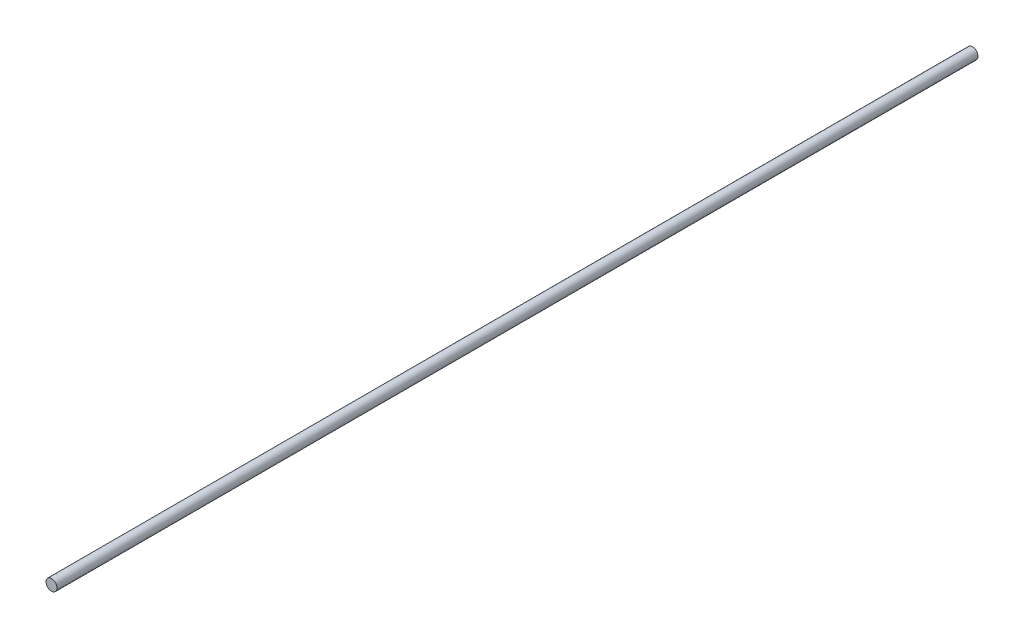
ISO-10303-21;
HEADER;
FILE_DESCRIPTION(('STEP AP214'),'2;1');
FILE_NAME('part.step','',(''),(''),'','','');
FILE_SCHEMA(('AUTOMOTIVE_DESIGN { 1 0 10303 214 1 1 1 1 }'));
ENDSEC;
DATA;
#1=APPLICATION_CONTEXT('core data for automotive mechanical design processes');
#2=APPLICATION_PROTOCOL_DEFINITION('international standard','automotive_design',2000,#1);
#3=PRODUCT_CONTEXT('',#1,'mechanical');
#4=PRODUCT('Part','Part','',(#3));
#5=PRODUCT_RELATED_PRODUCT_CATEGORY('part','',(#4));
#6=PRODUCT_DEFINITION_FORMATION('','',#4);
#7=PRODUCT_DEFINITION_CONTEXT('part definition',#1,'design');
#8=PRODUCT_DEFINITION('design','',#6,#7);
#9=PRODUCT_DEFINITION_SHAPE('','',#8);
#10=(LENGTH_UNIT() NAMED_UNIT(*) SI_UNIT(.MILLI.,.METRE.));
#11=(NAMED_UNIT(*) PLANE_ANGLE_UNIT() SI_UNIT($,.RADIAN.));
#12=(NAMED_UNIT(*) SI_UNIT($,.STERADIAN.) SOLID_ANGLE_UNIT());
#13=UNCERTAINTY_MEASURE_WITH_UNIT(LENGTH_MEASURE(1.E-05),#10,'distance_accuracy_value','');
#14=(GEOMETRIC_REPRESENTATION_CONTEXT(3) GLOBAL_UNCERTAINTY_ASSIGNED_CONTEXT((#13)) GLOBAL_UNIT_ASSIGNED_CONTEXT((#10,
#11,#12)) REPRESENTATION_CONTEXT('',''));
#15=CARTESIAN_POINT('',(0.,0.,0.));
#16=DIRECTION('',(0.,0.,1.));
#17=DIRECTION('',(1.,0.,0.));
#18=AXIS2_PLACEMENT_3D('',#15,#16,#17);
#19=CARTESIAN_POINT('',(0.,0.,200.));
#20=DIRECTION('',(0.,0.,-1.));
#21=DIRECTION('',(-1.,0.,0.));
#22=AXIS2_PLACEMENT_3D('',#19,#20,#21);
#23=CYLINDRICAL_SURFACE('',#22,1.2);
#24=CARTESIAN_POINT('',(0.,0.,200.));
#25=DIRECTION('',(0.,0.,1.));
#26=DIRECTION('',(1.,0.,0.));
#27=AXIS2_PLACEMENT_3D('',#24,#25,#26);
#28=CIRCLE('',#27,1.2);
#29=CARTESIAN_POINT('',(1.2,0.,200.));
#30=VERTEX_POINT('',#29);
#31=EDGE_CURVE('E10',#30,#30,#28,.T.);
#32=ORIENTED_EDGE('',*,*,#31,.F.);
#33=EDGE_LOOP('',(#32));
#34=FACE_BOUND('',#33,.T.);
#35=CARTESIAN_POINT('',(0.,0.,0.));
#36=DIRECTION('',(0.,0.,1.));
#37=DIRECTION('',(1.,0.,0.));
#38=AXIS2_PLACEMENT_3D('',#35,#36,#37);
#39=CIRCLE('',#38,1.2);
#40=CARTESIAN_POINT('',(1.2,0.,0.));
#41=VERTEX_POINT('',#40);
#42=EDGE_CURVE('E34',#41,#41,#39,.T.);
#43=ORIENTED_EDGE('',*,*,#42,.T.);
#44=EDGE_LOOP('',(#43));
#45=FACE_BOUND('',#44,.T.);
#46=ADVANCED_FACE('F31',(#34,#45),#23,.T.);
#47=CARTESIAN_POINT('',(0.,0.,200.));
#48=DIRECTION('',(0.,0.,1.));
#49=DIRECTION('',(1.,0.,0.));
#50=AXIS2_PLACEMENT_3D('',#47,#48,#49);
#51=PLANE('',#50);
#52=ORIENTED_EDGE('',*,*,#31,.T.);
#53=EDGE_LOOP('',(#52));
#54=FACE_BOUND('',#53,.T.);
#55=ADVANCED_FACE('F46',(#54),#51,.T.);
#56=CARTESIAN_POINT('',(0.,0.,0.));
#57=DIRECTION('',(0.,0.,1.));
#58=DIRECTION('',(1.,0.,0.));
#59=AXIS2_PLACEMENT_3D('',#56,#57,#58);
#60=PLANE('',#59);
#61=ORIENTED_EDGE('',*,*,#42,.F.);
#62=EDGE_LOOP('',(#61));
#63=FACE_BOUND('',#62,.T.);
#64=ADVANCED_FACE('F44',(#63),#60,.F.);
#65=CLOSED_SHELL('',(#46,#55,#64));
#66=MANIFOLD_SOLID_BREP('B2',#65);
#67=ADVANCED_BREP_SHAPE_REPRESENTATION('',(#18,#66),#14);
#68=SHAPE_DEFINITION_REPRESENTATION(#9,#67);
ENDSEC;
END-ISO-10303-21;
